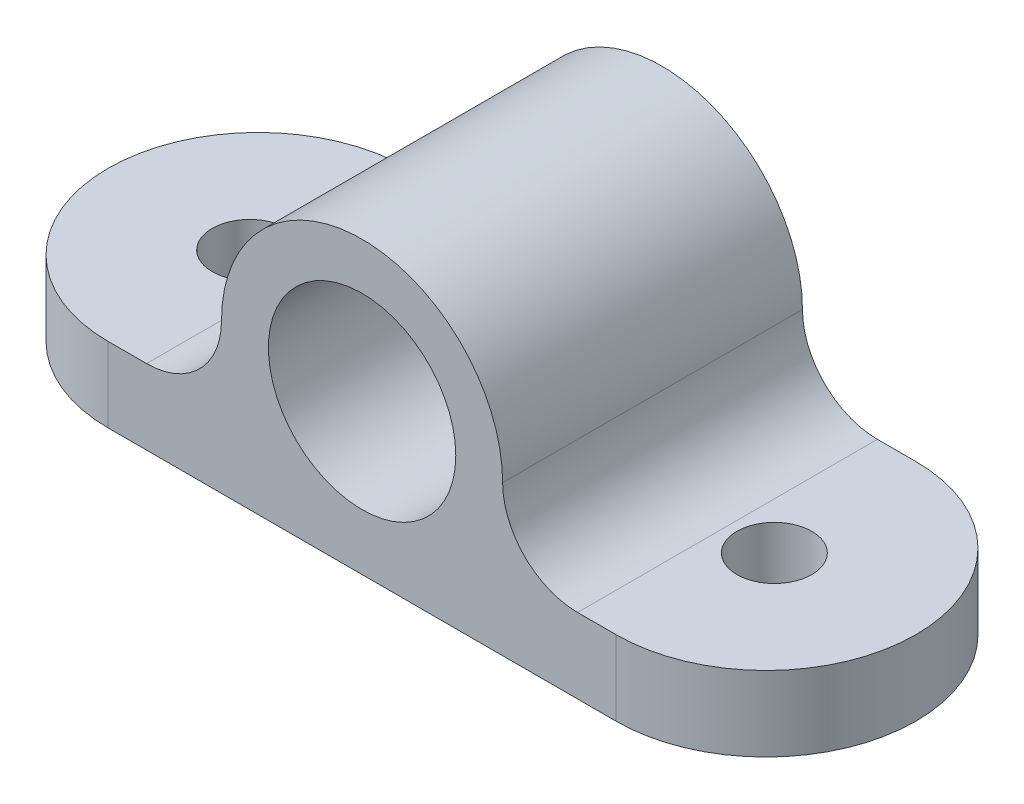
ISO-10303-21;
HEADER;
FILE_DESCRIPTION(('STEP AP214'),'2;1');
FILE_NAME('part.step','',(''),(''),'','','');
FILE_SCHEMA(('AUTOMOTIVE_DESIGN { 1 0 10303 214 1 1 1 1 }'));
ENDSEC;
DATA;
#1=APPLICATION_CONTEXT('core data for automotive mechanical design processes');
#2=APPLICATION_PROTOCOL_DEFINITION('international standard','automotive_design',2000,#1);
#3=PRODUCT_CONTEXT('',#1,'mechanical');
#4=PRODUCT('Part','Part','',(#3));
#5=PRODUCT_RELATED_PRODUCT_CATEGORY('part','',(#4));
#6=PRODUCT_DEFINITION_FORMATION('','',#4);
#7=PRODUCT_DEFINITION_CONTEXT('part definition',#1,'design');
#8=PRODUCT_DEFINITION('design','',#6,#7);
#9=PRODUCT_DEFINITION_SHAPE('','',#8);
#10=(LENGTH_UNIT() NAMED_UNIT(*) SI_UNIT(.MILLI.,.METRE.));
#11=(NAMED_UNIT(*) PLANE_ANGLE_UNIT() SI_UNIT($,.RADIAN.));
#12=(NAMED_UNIT(*) SI_UNIT($,.STERADIAN.) SOLID_ANGLE_UNIT());
#13=UNCERTAINTY_MEASURE_WITH_UNIT(LENGTH_MEASURE(1.E-05),#10,'distance_accuracy_value','');
#14=(GEOMETRIC_REPRESENTATION_CONTEXT(3) GLOBAL_UNCERTAINTY_ASSIGNED_CONTEXT((#13)) GLOBAL_UNIT_ASSIGNED_CONTEXT((#10,
#11,#12)) REPRESENTATION_CONTEXT('',''));
#15=CARTESIAN_POINT('',(0.,0.,0.));
#16=DIRECTION('',(0.,0.,1.));
#17=DIRECTION('',(1.,0.,0.));
#18=AXIS2_PLACEMENT_3D('',#15,#16,#17);
#19=CARTESIAN_POINT('',(-107.768643519735,0.,-80.));
#20=DIRECTION('',(0.,-1.,0.));
#21=DIRECTION('',(1.,0.,0.));
#22=AXIS2_PLACEMENT_3D('',#19,#20,#21);
#23=PLANE('',#22);
#24=CARTESIAN_POINT('',(70.,0.,-40.));
#25=DIRECTION('',(0.,-1.,0.));
#26=DIRECTION('',(1.,0.,0.));
#27=AXIS2_PLACEMENT_3D('',#24,#25,#26);
#28=CIRCLE('',#27,10.);
#29=CARTESIAN_POINT('',(80.,0.,-40.));
#30=VERTEX_POINT('',#29);
#31=EDGE_CURVE('E187',#30,#30,#28,.T.);
#32=ORIENTED_EDGE('',*,*,#31,.F.);
#33=EDGE_LOOP('',(#32));
#34=FACE_BOUND('',#33,.T.);
#35=CARTESIAN_POINT('',(-70.,0.,-40.));
#36=DIRECTION('',(0.,-1.,0.));
#37=DIRECTION('',(1.,0.,0.));
#38=AXIS2_PLACEMENT_3D('',#35,#36,#37);
#39=CIRCLE('',#38,10.);
#40=CARTESIAN_POINT('',(-60.,0.,-40.));
#41=VERTEX_POINT('',#40);
#42=EDGE_CURVE('E185',#41,#41,#39,.T.);
#43=ORIENTED_EDGE('',*,*,#42,.F.);
#44=EDGE_LOOP('',(#43));
#45=FACE_BOUND('',#44,.T.);
#46=CARTESIAN_POINT('',(-67.7686435197346,0.,-40.));
#47=DIRECTION('',(0.,-1.,0.));
#48=DIRECTION('',(1.,0.,0.));
#49=AXIS2_PLACEMENT_3D('',#46,#47,#48);
#50=CIRCLE('',#49,40.);
#51=CARTESIAN_POINT('',(-67.7686435197346,0.,0.));
#52=VERTEX_POINT('',#51);
#53=CARTESIAN_POINT('',(-67.7686435197346,0.,-80.));
#54=VERTEX_POINT('',#53);
#55=EDGE_CURVE('E55',#52,#54,#50,.T.);
#56=ORIENTED_EDGE('',*,*,#55,.T.);
#57=DIRECTION('',(1.,0.,0.));
#58=VECTOR('',#57,1.);
#59=CARTESIAN_POINT('',(-107.768643519735,0.,-80.));
#60=LINE('',#59,#58);
#61=CARTESIAN_POINT('',(67.7686435197346,0.,-80.));
#62=VERTEX_POINT('',#61);
#63=EDGE_CURVE('E48',#54,#62,#60,.T.);
#64=ORIENTED_EDGE('',*,*,#63,.T.);
#65=CARTESIAN_POINT('',(67.7686435197346,0.,-40.));
#66=DIRECTION('',(0.,-1.,0.));
#67=DIRECTION('',(1.,0.,0.));
#68=AXIS2_PLACEMENT_3D('',#65,#66,#67);
#69=CIRCLE('',#68,40.);
#70=CARTESIAN_POINT('',(67.7686435197346,0.,0.));
#71=VERTEX_POINT('',#70);
#72=EDGE_CURVE('E153',#71,#62,#69,.F.);
#73=ORIENTED_EDGE('',*,*,#72,.F.);
#74=DIRECTION('',(1.,0.,0.));
#75=VECTOR('',#74,1.);
#76=CARTESIAN_POINT('',(-107.768643519735,0.,0.));
#77=LINE('',#76,#75);
#78=EDGE_CURVE('E136',#52,#71,#77,.T.);
#79=ORIENTED_EDGE('',*,*,#78,.F.);
#80=EDGE_LOOP('',(#56,#64,#73,#79));
#81=FACE_BOUND('',#80,.T.);
#82=ADVANCED_FACE('F33',(#34,#45,#81),#23,.T.);
#83=CARTESIAN_POINT('',(-57.5000000000001,20.,-80.));
#84=DIRECTION('',(0.,1.,0.));
#85=DIRECTION('',(0.,0.,1.));
#86=AXIS2_PLACEMENT_3D('',#83,#84,#85);
#87=PLANE('',#86);
#88=CARTESIAN_POINT('',(-70.,20.,-40.));
#89=DIRECTION('',(0.,1.,0.));
#90=DIRECTION('',(0.,0.,1.));
#91=AXIS2_PLACEMENT_3D('',#88,#89,#90);
#92=CIRCLE('',#91,10.);
#93=CARTESIAN_POINT('',(-70.,20.,-30.));
#94=VERTEX_POINT('',#93);
#95=EDGE_CURVE('E193',#94,#94,#92,.T.);
#96=ORIENTED_EDGE('',*,*,#95,.F.);
#97=EDGE_LOOP('',(#96));
#98=FACE_BOUND('',#97,.T.);
#99=DIRECTION('',(-1.,0.,0.));
#100=VECTOR('',#99,1.);
#101=CARTESIAN_POINT('',(-57.5000000000001,20.,-80.));
#102=LINE('',#101,#100);
#103=CARTESIAN_POINT('',(-57.5000000000001,20.,-80.));
#104=VERTEX_POINT('',#103);
#105=CARTESIAN_POINT('',(-67.7686435197346,20.,-80.));
#106=VERTEX_POINT('',#105);
#107=EDGE_CURVE('E109',#104,#106,#102,.T.);
#108=ORIENTED_EDGE('',*,*,#107,.T.);
#109=CARTESIAN_POINT('',(-67.7686435197346,20.,-40.));
#110=DIRECTION('',(0.,1.,0.));
#111=DIRECTION('',(0.,0.,1.));
#112=AXIS2_PLACEMENT_3D('',#109,#110,#111);
#113=CIRCLE('',#112,40.);
#114=CARTESIAN_POINT('',(-67.7686435197346,20.,0.));
#115=VERTEX_POINT('',#114);
#116=EDGE_CURVE('E96',#106,#115,#113,.T.);
#117=ORIENTED_EDGE('',*,*,#116,.T.);
#118=DIRECTION('',(-1.,0.,0.));
#119=VECTOR('',#118,1.);
#120=CARTESIAN_POINT('',(-57.5000000000001,20.,0.));
#121=LINE('',#120,#119);
#122=CARTESIAN_POINT('',(-57.5000000000001,20.,0.));
#123=VERTEX_POINT('',#122);
#124=EDGE_CURVE('E134',#123,#115,#121,.T.);
#125=ORIENTED_EDGE('',*,*,#124,.F.);
#126=DIRECTION('',(0.,0.,1.));
#127=VECTOR('',#126,1.);
#128=CARTESIAN_POINT('',(-57.5000000000001,20.,-80.));
#129=LINE('',#128,#127);
#130=EDGE_CURVE('E113',#104,#123,#129,.T.);
#131=ORIENTED_EDGE('',*,*,#130,.F.);
#132=EDGE_LOOP('',(#108,#117,#125,#131));
#133=FACE_BOUND('',#132,.T.);
#134=ADVANCED_FACE('F112',(#98,#133),#87,.T.);
#135=CARTESIAN_POINT('',(107.768643519735,20.,-80.));
#136=DIRECTION('',(0.,1.,0.));
#137=DIRECTION('',(0.,0.,1.));
#138=AXIS2_PLACEMENT_3D('',#135,#136,#137);
#139=PLANE('',#138);
#140=CARTESIAN_POINT('',(70.,20.,-40.));
#141=DIRECTION('',(0.,1.,0.));
#142=DIRECTION('',(0.,0.,1.));
#143=AXIS2_PLACEMENT_3D('',#140,#141,#142);
#144=CIRCLE('',#143,10.);
#145=CARTESIAN_POINT('',(70.,20.,-30.));
#146=VERTEX_POINT('',#145);
#147=EDGE_CURVE('E192',#146,#146,#144,.T.);
#148=ORIENTED_EDGE('',*,*,#147,.F.);
#149=EDGE_LOOP('',(#148));
#150=FACE_BOUND('',#149,.T.);
#151=DIRECTION('',(-1.,0.,0.));
#152=VECTOR('',#151,1.);
#153=CARTESIAN_POINT('',(107.768643519735,20.,0.));
#154=LINE('',#153,#152);
#155=CARTESIAN_POINT('',(67.7686435197346,20.,0.));
#156=VERTEX_POINT('',#155);
#157=CARTESIAN_POINT('',(57.5000000000001,20.,0.));
#158=VERTEX_POINT('',#157);
#159=EDGE_CURVE('E122',#156,#158,#154,.T.);
#160=ORIENTED_EDGE('',*,*,#159,.F.);
#161=CARTESIAN_POINT('',(67.7686435197346,20.,-40.));
#162=DIRECTION('',(0.,1.,0.));
#163=DIRECTION('',(0.,0.,1.));
#164=AXIS2_PLACEMENT_3D('',#161,#162,#163);
#165=CIRCLE('',#164,40.);
#166=CARTESIAN_POINT('',(67.7686435197346,20.,-80.));
#167=VERTEX_POINT('',#166);
#168=EDGE_CURVE('E103',#167,#156,#165,.F.);
#169=ORIENTED_EDGE('',*,*,#168,.F.);
#170=DIRECTION('',(-1.,0.,0.));
#171=VECTOR('',#170,1.);
#172=CARTESIAN_POINT('',(107.768643519735,20.,-80.));
#173=LINE('',#172,#171);
#174=CARTESIAN_POINT('',(57.5000000000001,20.,-80.));
#175=VERTEX_POINT('',#174);
#176=EDGE_CURVE('E139',#167,#175,#173,.T.);
#177=ORIENTED_EDGE('',*,*,#176,.T.);
#178=DIRECTION('',(0.,0.,1.));
#179=VECTOR('',#178,1.);
#180=CARTESIAN_POINT('',(57.5000000000001,20.,-80.));
#181=LINE('',#180,#179);
#182=EDGE_CURVE('E116',#175,#158,#181,.T.);
#183=ORIENTED_EDGE('',*,*,#182,.T.);
#184=EDGE_LOOP('',(#160,#169,#177,#183));
#185=FACE_BOUND('',#184,.T.);
#186=ADVANCED_FACE('F35',(#150,#185),#139,.T.);
#187=CARTESIAN_POINT('',(-57.5,40.,-80.));
#188=DIRECTION('',(0.,0.,1.));
#189=DIRECTION('',(1.,0.,0.));
#190=AXIS2_PLACEMENT_3D('',#187,#188,#189);
#191=CYLINDRICAL_SURFACE('',#190,20.);
#192=CARTESIAN_POINT('',(-57.5,40.,0.));
#193=DIRECTION('',(0.,0.,-1.));
#194=DIRECTION('',(-1.,0.,0.));
#195=AXIS2_PLACEMENT_3D('',#192,#193,#194);
#196=CIRCLE('',#195,20.);
#197=CARTESIAN_POINT('',(-37.5,40.0000000000002,0.));
#198=VERTEX_POINT('',#197);
#199=EDGE_CURVE('E131',#198,#123,#196,.T.);
#200=ORIENTED_EDGE('',*,*,#199,.F.);
#201=DIRECTION('',(0.,0.,1.));
#202=VECTOR('',#201,1.);
#203=CARTESIAN_POINT('',(-37.5,40.0000000000002,-80.));
#204=LINE('',#203,#202);
#205=CARTESIAN_POINT('',(-37.5,40.0000000000002,-80.));
#206=VERTEX_POINT('',#205);
#207=EDGE_CURVE('E141',#206,#198,#204,.T.);
#208=ORIENTED_EDGE('',*,*,#207,.F.);
#209=CARTESIAN_POINT('',(-57.5,40.,-80.));
#210=DIRECTION('',(0.,0.,-1.));
#211=DIRECTION('',(-1.,0.,0.));
#212=AXIS2_PLACEMENT_3D('',#209,#210,#211);
#213=CIRCLE('',#212,20.);
#214=EDGE_CURVE('E114',#206,#104,#213,.T.);
#215=ORIENTED_EDGE('',*,*,#214,.T.);
#216=ORIENTED_EDGE('',*,*,#130,.T.);
#217=EDGE_LOOP('',(#200,#208,#215,#216));
#218=FACE_BOUND('',#217,.T.);
#219=ADVANCED_FACE('F202',(#218),#191,.F.);
#220=CARTESIAN_POINT('',(0.,40.,-80.));
#221=DIRECTION('',(0.,0.,1.));
#222=DIRECTION('',(1.,0.,0.));
#223=AXIS2_PLACEMENT_3D('',#220,#221,#222);
#224=CYLINDRICAL_SURFACE('',#223,37.5);
#225=CARTESIAN_POINT('',(0.,40.,0.));
#226=DIRECTION('',(0.,0.,1.));
#227=DIRECTION('',(1.,0.,0.));
#228=AXIS2_PLACEMENT_3D('',#225,#226,#227);
#229=CIRCLE('',#228,37.5);
#230=CARTESIAN_POINT('',(37.5,40.0000000000002,0.));
#231=VERTEX_POINT('',#230);
#232=EDGE_CURVE('E128',#231,#198,#229,.T.);
#233=ORIENTED_EDGE('',*,*,#232,.F.);
#234=DIRECTION('',(0.,0.,1.));
#235=VECTOR('',#234,1.);
#236=CARTESIAN_POINT('',(37.5,40.0000000000002,-80.));
#237=LINE('',#236,#235);
#238=CARTESIAN_POINT('',(37.5,40.0000000000002,-80.));
#239=VERTEX_POINT('',#238);
#240=EDGE_CURVE('E143',#239,#231,#237,.T.);
#241=ORIENTED_EDGE('',*,*,#240,.F.);
#242=CARTESIAN_POINT('',(0.,40.,-80.));
#243=DIRECTION('',(0.,0.,1.));
#244=DIRECTION('',(1.,0.,0.));
#245=AXIS2_PLACEMENT_3D('',#242,#243,#244);
#246=CIRCLE('',#245,37.5);
#247=EDGE_CURVE('E118',#239,#206,#246,.T.);
#248=ORIENTED_EDGE('',*,*,#247,.T.);
#249=ORIENTED_EDGE('',*,*,#207,.T.);
#250=EDGE_LOOP('',(#233,#241,#248,#249));
#251=FACE_BOUND('',#250,.T.);
#252=ADVANCED_FACE('F176',(#251),#224,.T.);
#253=CARTESIAN_POINT('',(57.5,40.,-80.));
#254=DIRECTION('',(0.,0.,1.));
#255=DIRECTION('',(1.,0.,0.));
#256=AXIS2_PLACEMENT_3D('',#253,#254,#255);
#257=CYLINDRICAL_SURFACE('',#256,20.);
#258=CARTESIAN_POINT('',(57.5,40.,0.));
#259=DIRECTION('',(0.,0.,-1.));
#260=DIRECTION('',(1.,0.,0.));
#261=AXIS2_PLACEMENT_3D('',#258,#259,#260);
#262=CIRCLE('',#261,20.);
#263=EDGE_CURVE('E124',#158,#231,#262,.T.);
#264=ORIENTED_EDGE('',*,*,#263,.F.);
#265=ORIENTED_EDGE('',*,*,#182,.F.);
#266=CARTESIAN_POINT('',(57.5,40.,-80.));
#267=DIRECTION('',(0.,0.,-1.));
#268=DIRECTION('',(1.,0.,0.));
#269=AXIS2_PLACEMENT_3D('',#266,#267,#268);
#270=CIRCLE('',#269,20.);
#271=EDGE_CURVE('E170',#175,#239,#270,.T.);
#272=ORIENTED_EDGE('',*,*,#271,.T.);
#273=ORIENTED_EDGE('',*,*,#240,.T.);
#274=EDGE_LOOP('',(#264,#265,#272,#273));
#275=FACE_BOUND('',#274,.T.);
#276=ADVANCED_FACE('F183',(#275),#257,.F.);
#277=CARTESIAN_POINT('',(57.5,40.,-80.));
#278=DIRECTION('',(0.,0.,1.));
#279=DIRECTION('',(1.,0.,0.));
#280=AXIS2_PLACEMENT_3D('',#277,#278,#279);
#281=PLANE('',#280);
#282=CARTESIAN_POINT('',(0.,40.,-80.));
#283=DIRECTION('',(0.,0.,1.));
#284=DIRECTION('',(1.,0.,0.));
#285=AXIS2_PLACEMENT_3D('',#282,#283,#284);
#286=CIRCLE('',#285,25.);
#287=CARTESIAN_POINT('',(25.,40.,-80.));
#288=VERTEX_POINT('',#287);
#289=EDGE_CURVE('E125',#288,#288,#286,.T.);
#290=ORIENTED_EDGE('',*,*,#289,.T.);
#291=EDGE_LOOP('',(#290));
#292=FACE_BOUND('',#291,.T.);
#293=ORIENTED_EDGE('',*,*,#63,.F.);
#294=DIRECTION('',(0.,1.,0.));
#295=VECTOR('',#294,1.);
#296=CARTESIAN_POINT('',(-67.7686435197346,-60.,-80.));
#297=LINE('',#296,#295);
#298=EDGE_CURVE('E11',#54,#106,#297,.T.);
#299=ORIENTED_EDGE('',*,*,#298,.T.);
#300=ORIENTED_EDGE('',*,*,#107,.F.);
#301=ORIENTED_EDGE('',*,*,#214,.F.);
#302=ORIENTED_EDGE('',*,*,#247,.F.);
#303=ORIENTED_EDGE('',*,*,#271,.F.);
#304=ORIENTED_EDGE('',*,*,#176,.F.);
#305=DIRECTION('',(0.,1.,0.));
#306=VECTOR('',#305,1.);
#307=CARTESIAN_POINT('',(67.7686435197346,-60.,-80.));
#308=LINE('',#307,#306);
#309=EDGE_CURVE('E148',#167,#62,#308,.F.);
#310=ORIENTED_EDGE('',*,*,#309,.T.);
#311=EDGE_LOOP('',(#293,#299,#300,#301,#302,#303,#304,#310));
#312=FACE_BOUND('',#311,.T.);
#313=ADVANCED_FACE('F107',(#292,#312),#281,.F.);
#314=CARTESIAN_POINT('',(57.5,40.,0.));
#315=DIRECTION('',(0.,0.,1.));
#316=DIRECTION('',(1.,0.,0.));
#317=AXIS2_PLACEMENT_3D('',#314,#315,#316);
#318=PLANE('',#317);
#319=DIRECTION('',(0.,1.,0.));
#320=VECTOR('',#319,1.);
#321=CARTESIAN_POINT('',(67.7686435197346,-60.,0.));
#322=LINE('',#321,#320);
#323=EDGE_CURVE('E41',#156,#71,#322,.F.);
#324=ORIENTED_EDGE('',*,*,#323,.F.);
#325=ORIENTED_EDGE('',*,*,#159,.T.);
#326=ORIENTED_EDGE('',*,*,#263,.T.);
#327=ORIENTED_EDGE('',*,*,#232,.T.);
#328=ORIENTED_EDGE('',*,*,#199,.T.);
#329=ORIENTED_EDGE('',*,*,#124,.T.);
#330=DIRECTION('',(0.,1.,0.));
#331=VECTOR('',#330,1.);
#332=CARTESIAN_POINT('',(-67.7686435197346,-60.,0.));
#333=LINE('',#332,#331);
#334=EDGE_CURVE('E98',#52,#115,#333,.T.);
#335=ORIENTED_EDGE('',*,*,#334,.F.);
#336=ORIENTED_EDGE('',*,*,#78,.T.);
#337=EDGE_LOOP('',(#324,#325,#326,#327,#328,#329,#335,#336));
#338=FACE_BOUND('',#337,.T.);
#339=CARTESIAN_POINT('',(0.,40.,0.));
#340=DIRECTION('',(0.,0.,1.));
#341=DIRECTION('',(1.,0.,0.));
#342=AXIS2_PLACEMENT_3D('',#339,#340,#341);
#343=CIRCLE('',#342,25.);
#344=CARTESIAN_POINT('',(25.,40.,0.));
#345=VERTEX_POINT('',#344);
#346=EDGE_CURVE('E160',#345,#345,#343,.T.);
#347=ORIENTED_EDGE('',*,*,#346,.F.);
#348=EDGE_LOOP('',(#347));
#349=FACE_BOUND('',#348,.T.);
#350=ADVANCED_FACE('F158',(#338,#349),#318,.T.);
#351=CARTESIAN_POINT('',(0.,40.,-80.));
#352=DIRECTION('',(0.,0.,1.));
#353=DIRECTION('',(1.,0.,0.));
#354=AXIS2_PLACEMENT_3D('',#351,#352,#353);
#355=CYLINDRICAL_SURFACE('',#354,25.);
#356=ORIENTED_EDGE('',*,*,#289,.F.);
#357=EDGE_LOOP('',(#356));
#358=FACE_BOUND('',#357,.T.);
#359=ORIENTED_EDGE('',*,*,#346,.T.);
#360=EDGE_LOOP('',(#359));
#361=FACE_BOUND('',#360,.T.);
#362=ADVANCED_FACE('F230',(#358,#361),#355,.F.);
#363=CARTESIAN_POINT('',(-67.7686435197346,-60.,-40.));
#364=DIRECTION('',(0.,1.,0.));
#365=DIRECTION('',(0.,0.,1.));
#366=AXIS2_PLACEMENT_3D('',#363,#364,#365);
#367=CYLINDRICAL_SURFACE('',#366,40.);
#368=ORIENTED_EDGE('',*,*,#334,.T.);
#369=ORIENTED_EDGE('',*,*,#116,.F.);
#370=ORIENTED_EDGE('',*,*,#298,.F.);
#371=ORIENTED_EDGE('',*,*,#55,.F.);
#372=EDGE_LOOP('',(#368,#369,#370,#371));
#373=FACE_BOUND('',#372,.T.);
#374=ADVANCED_FACE('F97',(#373),#367,.T.);
#375=CARTESIAN_POINT('',(67.7686435197346,-60.,-40.));
#376=DIRECTION('',(0.,1.,0.));
#377=DIRECTION('',(0.,0.,1.));
#378=AXIS2_PLACEMENT_3D('',#375,#376,#377);
#379=CYLINDRICAL_SURFACE('',#378,40.);
#380=ORIENTED_EDGE('',*,*,#72,.T.);
#381=ORIENTED_EDGE('',*,*,#309,.F.);
#382=ORIENTED_EDGE('',*,*,#168,.T.);
#383=ORIENTED_EDGE('',*,*,#323,.T.);
#384=EDGE_LOOP('',(#380,#381,#382,#383));
#385=FACE_BOUND('',#384,.T.);
#386=ADVANCED_FACE('F152',(#385),#379,.T.);
#387=CARTESIAN_POINT('',(70.,-60.,-40.));
#388=DIRECTION('',(0.,1.,0.));
#389=DIRECTION('',(0.,0.,1.));
#390=AXIS2_PLACEMENT_3D('',#387,#388,#389);
#391=CYLINDRICAL_SURFACE('',#390,10.);
#392=ORIENTED_EDGE('',*,*,#31,.T.);
#393=EDGE_LOOP('',(#392));
#394=FACE_BOUND('',#393,.T.);
#395=ORIENTED_EDGE('',*,*,#147,.T.);
#396=EDGE_LOOP('',(#395));
#397=FACE_BOUND('',#396,.T.);
#398=ADVANCED_FACE('F199',(#394,#397),#391,.F.);
#399=CARTESIAN_POINT('',(-70.,-60.,-40.));
#400=DIRECTION('',(0.,1.,0.));
#401=DIRECTION('',(0.,0.,1.));
#402=AXIS2_PLACEMENT_3D('',#399,#400,#401);
#403=CYLINDRICAL_SURFACE('',#402,10.);
#404=ORIENTED_EDGE('',*,*,#42,.T.);
#405=EDGE_LOOP('',(#404));
#406=FACE_BOUND('',#405,.T.);
#407=ORIENTED_EDGE('',*,*,#95,.T.);
#408=EDGE_LOOP('',(#407));
#409=FACE_BOUND('',#408,.T.);
#410=ADVANCED_FACE('F239',(#406,#409),#403,.F.);
#411=CLOSED_SHELL('',(#82,#134,#186,#219,#252,#276,#313,#350,#362,#374,#386,#398,#410));
#412=MANIFOLD_SOLID_BREP('B2',#411);
#413=ADVANCED_BREP_SHAPE_REPRESENTATION('',(#18,#412),#14);
#414=SHAPE_DEFINITION_REPRESENTATION(#9,#413);
ENDSEC;
END-ISO-10303-21;
